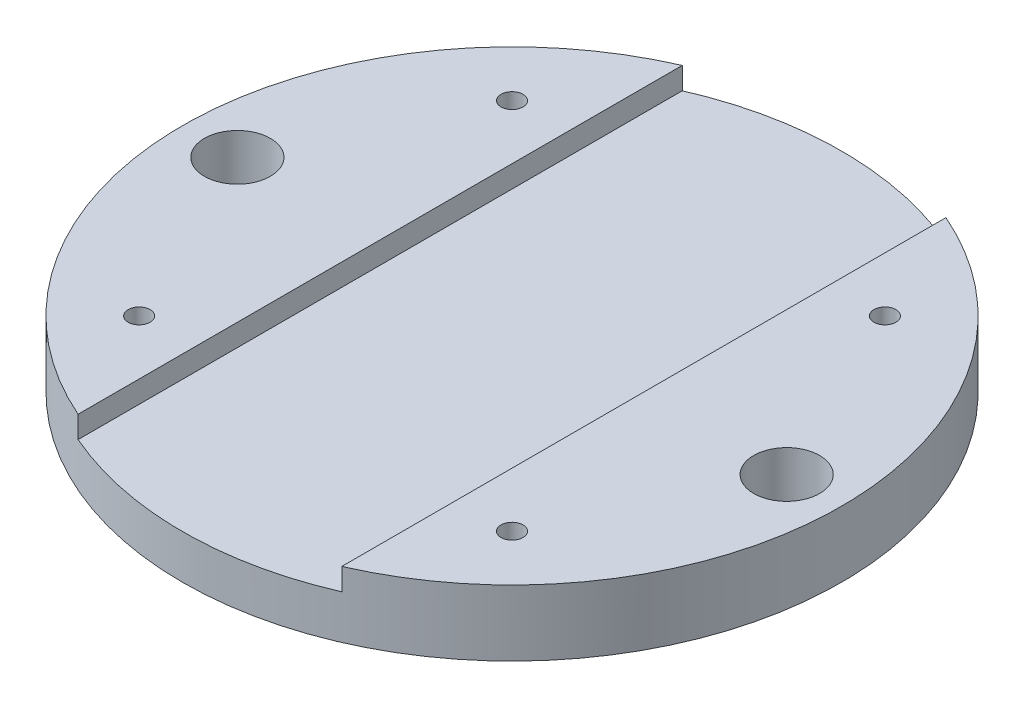
ISO-10303-21;
HEADER;
FILE_DESCRIPTION(('STEP AP214'),'2;1');
FILE_NAME('part.step','',(''),(''),'','','');
FILE_SCHEMA(('AUTOMOTIVE_DESIGN { 1 0 10303 214 1 1 1 1 }'));
ENDSEC;
DATA;
#1=APPLICATION_CONTEXT('core data for automotive mechanical design processes');
#2=APPLICATION_PROTOCOL_DEFINITION('international standard','automotive_design',2000,#1);
#3=PRODUCT_CONTEXT('',#1,'mechanical');
#4=PRODUCT('Part','Part','',(#3));
#5=PRODUCT_RELATED_PRODUCT_CATEGORY('part','',(#4));
#6=PRODUCT_DEFINITION_FORMATION('','',#4);
#7=PRODUCT_DEFINITION_CONTEXT('part definition',#1,'design');
#8=PRODUCT_DEFINITION('design','',#6,#7);
#9=PRODUCT_DEFINITION_SHAPE('','',#8);
#10=(LENGTH_UNIT() NAMED_UNIT(*) SI_UNIT(.MILLI.,.METRE.));
#11=(NAMED_UNIT(*) PLANE_ANGLE_UNIT() SI_UNIT($,.RADIAN.));
#12=(NAMED_UNIT(*) SI_UNIT($,.STERADIAN.) SOLID_ANGLE_UNIT());
#13=UNCERTAINTY_MEASURE_WITH_UNIT(LENGTH_MEASURE(1.E-05),#10,'distance_accuracy_value','');
#14=(GEOMETRIC_REPRESENTATION_CONTEXT(3) GLOBAL_UNCERTAINTY_ASSIGNED_CONTEXT((#13)) GLOBAL_UNIT_ASSIGNED_CONTEXT((#10,
#11,#12)) REPRESENTATION_CONTEXT('',''));
#15=CARTESIAN_POINT('',(0.,0.,0.));
#16=DIRECTION('',(0.,0.,1.));
#17=DIRECTION('',(1.,0.,0.));
#18=AXIS2_PLACEMENT_3D('',#15,#16,#17);
#19=CARTESIAN_POINT('',(0.,3.,0.));
#20=DIRECTION('',(0.,1.,0.));
#21=DIRECTION('',(0.,0.,1.));
#22=AXIS2_PLACEMENT_3D('',#19,#20,#21);
#23=PLANE('',#22);
#24=CARTESIAN_POINT('',(8.48528137423855,3.,8.48528137423859));
#25=DIRECTION('',(0.,1.,0.));
#26=DIRECTION('',(0.,0.,-1.));
#27=AXIS2_PLACEMENT_3D('',#24,#25,#26);
#28=CIRCLE('',#27,0.500000000000011);
#29=CARTESIAN_POINT('',(8.48528137423855,3.,7.98528137423857));
#30=VERTEX_POINT('',#29);
#31=EDGE_CURVE('E132',#30,#30,#28,.T.);
#32=ORIENTED_EDGE('',*,*,#31,.F.);
#33=EDGE_LOOP('',(#32));
#34=FACE_BOUND('',#33,.T.);
#35=CARTESIAN_POINT('',(8.48528137423855,3.,-8.48528137423859));
#36=DIRECTION('',(0.,1.,0.));
#37=DIRECTION('',(0.,0.,1.));
#38=AXIS2_PLACEMENT_3D('',#35,#36,#37);
#39=CIRCLE('',#38,0.500000000000011);
#40=CARTESIAN_POINT('',(8.48528137423855,3.,-7.98528137423857));
#41=VERTEX_POINT('',#40);
#42=EDGE_CURVE('E120',#41,#41,#39,.T.);
#43=ORIENTED_EDGE('',*,*,#42,.F.);
#44=EDGE_LOOP('',(#43));
#45=FACE_BOUND('',#44,.T.);
#46=CARTESIAN_POINT('',(12.5,3.,0.));
#47=DIRECTION('',(0.,1.,0.));
#48=DIRECTION('',(0.,0.,1.));
#49=AXIS2_PLACEMENT_3D('',#46,#47,#48);
#50=CIRCLE('',#49,1.5);
#51=CARTESIAN_POINT('',(12.5,3.,1.5));
#52=VERTEX_POINT('',#51);
#53=EDGE_CURVE('E108',#52,#52,#50,.T.);
#54=ORIENTED_EDGE('',*,*,#53,.F.);
#55=EDGE_LOOP('',(#54));
#56=FACE_BOUND('',#55,.T.);
#57=DIRECTION('',(0.,0.,-1.));
#58=VECTOR('',#57,1.);
#59=CARTESIAN_POINT('',(6.,3.,0.));
#60=LINE('',#59,#58);
#61=CARTESIAN_POINT('',(6.,3.,13.7477270848675));
#62=VERTEX_POINT('',#61);
#63=CARTESIAN_POINT('',(6.,3.,-13.7477270848675));
#64=VERTEX_POINT('',#63);
#65=EDGE_CURVE('E91',#62,#64,#60,.T.);
#66=ORIENTED_EDGE('',*,*,#65,.F.);
#67=CARTESIAN_POINT('',(0.,3.,0.));
#68=DIRECTION('',(0.,1.,0.));
#69=DIRECTION('',(0.,0.,1.));
#70=AXIS2_PLACEMENT_3D('',#67,#68,#69);
#71=CIRCLE('',#70,15.);
#72=EDGE_CURVE('E78',#62,#64,#71,.T.);
#73=ORIENTED_EDGE('',*,*,#72,.T.);
#74=EDGE_LOOP('',(#66,#73));
#75=FACE_BOUND('',#74,.T.);
#76=ADVANCED_FACE('F37',(#34,#45,#56,#75),#23,.T.);
#77=CARTESIAN_POINT('',(0.,3.,0.));
#78=DIRECTION('',(0.,-1.,0.));
#79=DIRECTION('',(0.,0.,-1.));
#80=AXIS2_PLACEMENT_3D('',#77,#78,#79);
#81=CYLINDRICAL_SURFACE('',#80,15.);
#82=CARTESIAN_POINT('',(0.,2.,0.));
#83=DIRECTION('',(0.,-1.,0.));
#84=DIRECTION('',(0.,0.,-1.));
#85=AXIS2_PLACEMENT_3D('',#82,#83,#84);
#86=CIRCLE('',#85,15.);
#87=CARTESIAN_POINT('',(-6.,2.,-13.7477270848675));
#88=VERTEX_POINT('',#87);
#89=CARTESIAN_POINT('',(6.,2.,-13.7477270848675));
#90=VERTEX_POINT('',#89);
#91=EDGE_CURVE('E11',#88,#90,#86,.T.);
#92=ORIENTED_EDGE('',*,*,#91,.T.);
#93=DIRECTION('',(0.,-1.,0.));
#94=VECTOR('',#93,1.);
#95=CARTESIAN_POINT('',(6.,2.99999999999999,-13.7477270848675));
#96=LINE('',#95,#94);
#97=EDGE_CURVE('E100',#90,#64,#96,.F.);
#98=ORIENTED_EDGE('',*,*,#97,.T.);
#99=ORIENTED_EDGE('',*,*,#72,.F.);
#100=DIRECTION('',(0.,-1.,0.));
#101=VECTOR('',#100,1.);
#102=CARTESIAN_POINT('',(6.,2.99999999999999,13.7477270848675));
#103=LINE('',#102,#101);
#104=CARTESIAN_POINT('',(6.,2.,13.7477270848675));
#105=VERTEX_POINT('',#104);
#106=EDGE_CURVE('E97',#62,#105,#103,.T.);
#107=ORIENTED_EDGE('',*,*,#106,.T.);
#108=CARTESIAN_POINT('',(-6.,2.,13.7477270848675));
#109=VERTEX_POINT('',#108);
#110=EDGE_CURVE('E41',#105,#109,#86,.T.);
#111=ORIENTED_EDGE('',*,*,#110,.T.);
#112=DIRECTION('',(0.,-1.,0.));
#113=VECTOR('',#112,1.);
#114=CARTESIAN_POINT('',(-6.,2.99999999999999,13.7477270848675));
#115=LINE('',#114,#113);
#116=CARTESIAN_POINT('',(-6.,3.,13.7477270848675));
#117=VERTEX_POINT('',#116);
#118=EDGE_CURVE('E82',#109,#117,#115,.F.);
#119=ORIENTED_EDGE('',*,*,#118,.T.);
#120=CARTESIAN_POINT('',(-6.,3.,-13.7477270848675));
#121=VERTEX_POINT('',#120);
#122=EDGE_CURVE('E73',#121,#117,#71,.T.);
#123=ORIENTED_EDGE('',*,*,#122,.F.);
#124=DIRECTION('',(0.,-1.,0.));
#125=VECTOR('',#124,1.);
#126=CARTESIAN_POINT('',(-6.,2.99999999999999,-13.7477270848675));
#127=LINE('',#126,#125);
#128=EDGE_CURVE('E55',#121,#88,#127,.T.);
#129=ORIENTED_EDGE('',*,*,#128,.T.);
#130=EDGE_LOOP('',(#92,#98,#99,#107,#111,#119,#123,#129));
#131=FACE_BOUND('',#130,.T.);
#132=CARTESIAN_POINT('',(0.,0.,0.));
#133=DIRECTION('',(0.,1.,0.));
#134=DIRECTION('',(0.,0.,1.));
#135=AXIS2_PLACEMENT_3D('',#132,#133,#134);
#136=CIRCLE('',#135,15.);
#137=CARTESIAN_POINT('',(0.,0.,15.));
#138=VERTEX_POINT('',#137);
#139=EDGE_CURVE('E79',#138,#138,#136,.T.);
#140=ORIENTED_EDGE('',*,*,#139,.T.);
#141=EDGE_LOOP('',(#140));
#142=FACE_BOUND('',#141,.T.);
#143=ADVANCED_FACE('F39',(#131,#142),#81,.T.);
#144=CARTESIAN_POINT('',(-8.48528137423855,3.,8.48528137423859));
#145=DIRECTION('',(0.,1.,0.));
#146=DIRECTION('',(0.,0.,1.));
#147=AXIS2_PLACEMENT_3D('',#144,#145,#146);
#148=CIRCLE('',#147,0.500000000000011);
#149=CARTESIAN_POINT('',(-8.48528137423855,3.,8.9852813742386));
#150=VERTEX_POINT('',#149);
#151=EDGE_CURVE('E138',#150,#150,#148,.T.);
#152=ORIENTED_EDGE('',*,*,#151,.F.);
#153=EDGE_LOOP('',(#152));
#154=FACE_BOUND('',#153,.T.);
#155=CARTESIAN_POINT('',(-8.48528137423855,3.,-8.48528137423859));
#156=DIRECTION('',(0.,1.,0.));
#157=DIRECTION('',(0.,0.,-1.));
#158=AXIS2_PLACEMENT_3D('',#155,#156,#157);
#159=CIRCLE('',#158,0.500000000000011);
#160=CARTESIAN_POINT('',(-8.48528137423855,3.,-8.9852813742386));
#161=VERTEX_POINT('',#160);
#162=EDGE_CURVE('E126',#161,#161,#159,.T.);
#163=ORIENTED_EDGE('',*,*,#162,.F.);
#164=EDGE_LOOP('',(#163));
#165=FACE_BOUND('',#164,.T.);
#166=CARTESIAN_POINT('',(-12.5,3.,0.));
#167=DIRECTION('',(0.,1.,0.));
#168=DIRECTION('',(0.,0.,-1.));
#169=AXIS2_PLACEMENT_3D('',#166,#167,#168);
#170=CIRCLE('',#169,1.5);
#171=CARTESIAN_POINT('',(-12.5,3.,-1.49999999999999));
#172=VERTEX_POINT('',#171);
#173=EDGE_CURVE('E114',#172,#172,#170,.T.);
#174=ORIENTED_EDGE('',*,*,#173,.F.);
#175=EDGE_LOOP('',(#174));
#176=FACE_BOUND('',#175,.T.);
#177=DIRECTION('',(0.,0.,1.));
#178=VECTOR('',#177,1.);
#179=CARTESIAN_POINT('',(-6.,3.,0.));
#180=LINE('',#179,#178);
#181=EDGE_CURVE('E77',#121,#117,#180,.T.);
#182=ORIENTED_EDGE('',*,*,#181,.F.);
#183=ORIENTED_EDGE('',*,*,#122,.T.);
#184=EDGE_LOOP('',(#182,#183));
#185=FACE_BOUND('',#184,.T.);
#186=ADVANCED_FACE('F75',(#154,#165,#176,#185),#23,.T.);
#187=CARTESIAN_POINT('',(0.,0.,0.));
#188=DIRECTION('',(0.,1.,0.));
#189=DIRECTION('',(0.,0.,1.));
#190=AXIS2_PLACEMENT_3D('',#187,#188,#189);
#191=PLANE('',#190);
#192=CARTESIAN_POINT('',(-8.48528137423855,0.,8.48528137423859));
#193=DIRECTION('',(0.,1.,0.));
#194=DIRECTION('',(0.,0.,1.));
#195=AXIS2_PLACEMENT_3D('',#192,#193,#194);
#196=CIRCLE('',#195,0.500000000000011);
#197=CARTESIAN_POINT('',(-8.48528137423855,0.,8.9852813742386));
#198=VERTEX_POINT('',#197);
#199=EDGE_CURVE('E135',#198,#198,#196,.T.);
#200=ORIENTED_EDGE('',*,*,#199,.T.);
#201=EDGE_LOOP('',(#200));
#202=FACE_BOUND('',#201,.T.);
#203=CARTESIAN_POINT('',(8.48528137423855,0.,8.48528137423859));
#204=DIRECTION('',(0.,1.,0.));
#205=DIRECTION('',(0.,0.,-1.));
#206=AXIS2_PLACEMENT_3D('',#203,#204,#205);
#207=CIRCLE('',#206,0.500000000000011);
#208=CARTESIAN_POINT('',(8.48528137423855,0.,7.98528137423857));
#209=VERTEX_POINT('',#208);
#210=EDGE_CURVE('E129',#209,#209,#207,.T.);
#211=ORIENTED_EDGE('',*,*,#210,.T.);
#212=EDGE_LOOP('',(#211));
#213=FACE_BOUND('',#212,.T.);
#214=CARTESIAN_POINT('',(-8.48528137423855,0.,-8.48528137423859));
#215=DIRECTION('',(0.,1.,0.));
#216=DIRECTION('',(0.,0.,-1.));
#217=AXIS2_PLACEMENT_3D('',#214,#215,#216);
#218=CIRCLE('',#217,0.500000000000011);
#219=CARTESIAN_POINT('',(-8.48528137423855,0.,-8.9852813742386));
#220=VERTEX_POINT('',#219);
#221=EDGE_CURVE('E123',#220,#220,#218,.T.);
#222=ORIENTED_EDGE('',*,*,#221,.T.);
#223=EDGE_LOOP('',(#222));
#224=FACE_BOUND('',#223,.T.);
#225=CARTESIAN_POINT('',(8.48528137423855,0.,-8.48528137423859));
#226=DIRECTION('',(0.,1.,0.));
#227=DIRECTION('',(0.,0.,1.));
#228=AXIS2_PLACEMENT_3D('',#225,#226,#227);
#229=CIRCLE('',#228,0.500000000000011);
#230=CARTESIAN_POINT('',(8.48528137423855,0.,-7.98528137423857));
#231=VERTEX_POINT('',#230);
#232=EDGE_CURVE('E117',#231,#231,#229,.T.);
#233=ORIENTED_EDGE('',*,*,#232,.T.);
#234=EDGE_LOOP('',(#233));
#235=FACE_BOUND('',#234,.T.);
#236=CARTESIAN_POINT('',(-12.5,0.,0.));
#237=DIRECTION('',(0.,1.,0.));
#238=DIRECTION('',(0.,0.,-1.));
#239=AXIS2_PLACEMENT_3D('',#236,#237,#238);
#240=CIRCLE('',#239,1.5);
#241=CARTESIAN_POINT('',(-12.5,0.,-1.49999999999999));
#242=VERTEX_POINT('',#241);
#243=EDGE_CURVE('E111',#242,#242,#240,.T.);
#244=ORIENTED_EDGE('',*,*,#243,.T.);
#245=EDGE_LOOP('',(#244));
#246=FACE_BOUND('',#245,.T.);
#247=CARTESIAN_POINT('',(12.5,0.,0.));
#248=DIRECTION('',(0.,1.,0.));
#249=DIRECTION('',(0.,0.,1.));
#250=AXIS2_PLACEMENT_3D('',#247,#248,#249);
#251=CIRCLE('',#250,1.5);
#252=CARTESIAN_POINT('',(12.5,0.,1.5));
#253=VERTEX_POINT('',#252);
#254=EDGE_CURVE('E107',#253,#253,#251,.T.);
#255=ORIENTED_EDGE('',*,*,#254,.T.);
#256=EDGE_LOOP('',(#255));
#257=FACE_BOUND('',#256,.T.);
#258=ORIENTED_EDGE('',*,*,#139,.F.);
#259=EDGE_LOOP('',(#258));
#260=FACE_BOUND('',#259,.T.);
#261=ADVANCED_FACE('F144',(#202,#213,#224,#235,#246,#257,#260),#191,.F.);
#262=CARTESIAN_POINT('',(-6.,2.,71.9154257953418));
#263=DIRECTION('',(0.,-1.,0.));
#264=DIRECTION('',(0.,0.,-1.));
#265=AXIS2_PLACEMENT_3D('',#262,#263,#264);
#266=PLANE('',#265);
#267=ORIENTED_EDGE('',*,*,#110,.F.);
#268=DIRECTION('',(0.,0.,-1.));
#269=VECTOR('',#268,1.);
#270=CARTESIAN_POINT('',(6.,2.,71.9154257953418));
#271=LINE('',#270,#269);
#272=EDGE_CURVE('E88',#105,#90,#271,.T.);
#273=ORIENTED_EDGE('',*,*,#272,.T.);
#274=ORIENTED_EDGE('',*,*,#91,.F.);
#275=DIRECTION('',(0.,0.,-1.));
#276=VECTOR('',#275,1.);
#277=CARTESIAN_POINT('',(-6.,2.,71.9154257953418));
#278=LINE('',#277,#276);
#279=EDGE_CURVE('E105',#109,#88,#278,.T.);
#280=ORIENTED_EDGE('',*,*,#279,.F.);
#281=EDGE_LOOP('',(#267,#273,#274,#280));
#282=FACE_BOUND('',#281,.T.);
#283=ADVANCED_FACE('F188',(#282),#266,.F.);
#284=CARTESIAN_POINT('',(6.,2.,71.9154257953418));
#285=DIRECTION('',(1.,0.,0.));
#286=DIRECTION('',(0.,1.,0.));
#287=AXIS2_PLACEMENT_3D('',#284,#285,#286);
#288=PLANE('',#287);
#289=ORIENTED_EDGE('',*,*,#106,.F.);
#290=ORIENTED_EDGE('',*,*,#65,.T.);
#291=ORIENTED_EDGE('',*,*,#97,.F.);
#292=ORIENTED_EDGE('',*,*,#272,.F.);
#293=EDGE_LOOP('',(#289,#290,#291,#292));
#294=FACE_BOUND('',#293,.T.);
#295=ADVANCED_FACE('F185',(#294),#288,.F.);
#296=CARTESIAN_POINT('',(-6.,2.,71.9154257953418));
#297=DIRECTION('',(-1.,0.,0.));
#298=DIRECTION('',(0.,-1.,0.));
#299=AXIS2_PLACEMENT_3D('',#296,#297,#298);
#300=PLANE('',#299);
#301=ORIENTED_EDGE('',*,*,#128,.F.);
#302=ORIENTED_EDGE('',*,*,#181,.T.);
#303=ORIENTED_EDGE('',*,*,#118,.F.);
#304=ORIENTED_EDGE('',*,*,#279,.T.);
#305=EDGE_LOOP('',(#301,#302,#303,#304));
#306=FACE_BOUND('',#305,.T.);
#307=ADVANCED_FACE('F90',(#306),#300,.F.);
#308=CARTESIAN_POINT('',(12.5,0.,0.));
#309=DIRECTION('',(0.,1.,0.));
#310=DIRECTION('',(0.,0.,1.));
#311=AXIS2_PLACEMENT_3D('',#308,#309,#310);
#312=CYLINDRICAL_SURFACE('',#311,1.5);
#313=ORIENTED_EDGE('',*,*,#254,.F.);
#314=EDGE_LOOP('',(#313));
#315=FACE_BOUND('',#314,.T.);
#316=ORIENTED_EDGE('',*,*,#53,.T.);
#317=EDGE_LOOP('',(#316));
#318=FACE_BOUND('',#317,.T.);
#319=ADVANCED_FACE('F164',(#315,#318),#312,.F.);
#320=CARTESIAN_POINT('',(-12.5,0.,0.));
#321=DIRECTION('',(0.,1.,0.));
#322=DIRECTION('',(0.,0.,1.));
#323=AXIS2_PLACEMENT_3D('',#320,#321,#322);
#324=CYLINDRICAL_SURFACE('',#323,1.5);
#325=ORIENTED_EDGE('',*,*,#243,.F.);
#326=EDGE_LOOP('',(#325));
#327=FACE_BOUND('',#326,.T.);
#328=ORIENTED_EDGE('',*,*,#173,.T.);
#329=EDGE_LOOP('',(#328));
#330=FACE_BOUND('',#329,.T.);
#331=ADVANCED_FACE('F161',(#327,#330),#324,.F.);
#332=CARTESIAN_POINT('',(8.48528137423855,0.,-8.48528137423859));
#333=DIRECTION('',(0.,1.,0.));
#334=DIRECTION('',(0.,0.,1.));
#335=AXIS2_PLACEMENT_3D('',#332,#333,#334);
#336=CYLINDRICAL_SURFACE('',#335,0.500000000000011);
#337=ORIENTED_EDGE('',*,*,#232,.F.);
#338=EDGE_LOOP('',(#337));
#339=FACE_BOUND('',#338,.T.);
#340=ORIENTED_EDGE('',*,*,#42,.T.);
#341=EDGE_LOOP('',(#340));
#342=FACE_BOUND('',#341,.T.);
#343=ADVANCED_FACE('F163',(#339,#342),#336,.F.);
#344=CARTESIAN_POINT('',(-8.48528137423855,0.,-8.48528137423859));
#345=DIRECTION('',(0.,1.,0.));
#346=DIRECTION('',(0.,0.,1.));
#347=AXIS2_PLACEMENT_3D('',#344,#345,#346);
#348=CYLINDRICAL_SURFACE('',#347,0.500000000000011);
#349=ORIENTED_EDGE('',*,*,#221,.F.);
#350=EDGE_LOOP('',(#349));
#351=FACE_BOUND('',#350,.T.);
#352=ORIENTED_EDGE('',*,*,#162,.T.);
#353=EDGE_LOOP('',(#352));
#354=FACE_BOUND('',#353,.T.);
#355=ADVANCED_FACE('F171',(#351,#354),#348,.F.);
#356=CARTESIAN_POINT('',(8.48528137423855,0.,8.48528137423859));
#357=DIRECTION('',(0.,1.,0.));
#358=DIRECTION('',(0.,0.,1.));
#359=AXIS2_PLACEMENT_3D('',#356,#357,#358);
#360=CYLINDRICAL_SURFACE('',#359,0.500000000000011);
#361=ORIENTED_EDGE('',*,*,#210,.F.);
#362=EDGE_LOOP('',(#361));
#363=FACE_BOUND('',#362,.T.);
#364=ORIENTED_EDGE('',*,*,#31,.T.);
#365=EDGE_LOOP('',(#364));
#366=FACE_BOUND('',#365,.T.);
#367=ADVANCED_FACE('F150',(#363,#366),#360,.F.);
#368=CARTESIAN_POINT('',(-8.48528137423855,0.,8.48528137423859));
#369=DIRECTION('',(0.,1.,0.));
#370=DIRECTION('',(0.,0.,1.));
#371=AXIS2_PLACEMENT_3D('',#368,#369,#370);
#372=CYLINDRICAL_SURFACE('',#371,0.500000000000011);
#373=ORIENTED_EDGE('',*,*,#199,.F.);
#374=EDGE_LOOP('',(#373));
#375=FACE_BOUND('',#374,.T.);
#376=ORIENTED_EDGE('',*,*,#151,.T.);
#377=EDGE_LOOP('',(#376));
#378=FACE_BOUND('',#377,.T.);
#379=ADVANCED_FACE('F147',(#375,#378),#372,.F.);
#380=CLOSED_SHELL('',(#76,#143,#186,#261,#283,#295,#307,#319,#331,#343,#355,#367,#379));
#381=MANIFOLD_SOLID_BREP('B2',#380);
#382=ADVANCED_BREP_SHAPE_REPRESENTATION('',(#18,#381),#14);
#383=SHAPE_DEFINITION_REPRESENTATION(#9,#382);
ENDSEC;
END-ISO-10303-21;
